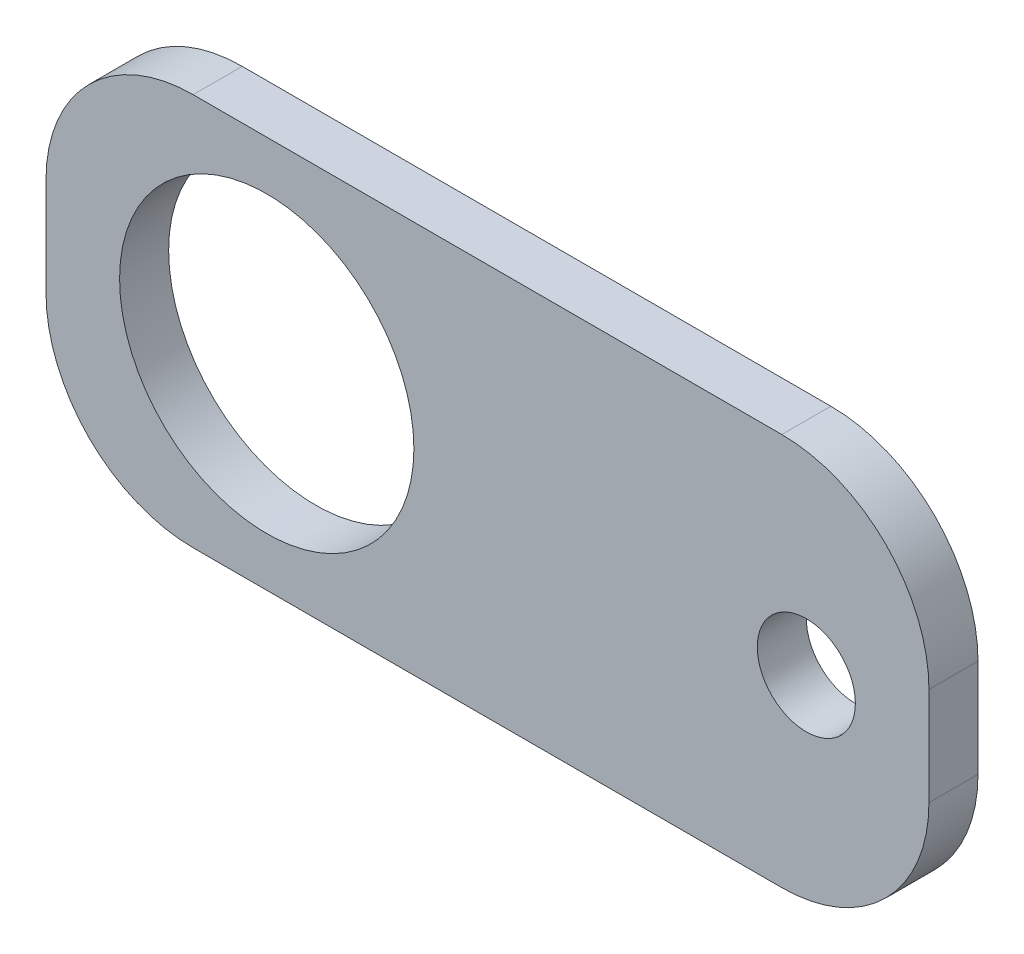
ISO-10303-21;
HEADER;
FILE_DESCRIPTION(('STEP AP214'),'2;1');
FILE_NAME('part.step','',(''),(''),'','','');
FILE_SCHEMA(('AUTOMOTIVE_DESIGN { 1 0 10303 214 1 1 1 1 }'));
ENDSEC;
DATA;
#1=APPLICATION_CONTEXT('core data for automotive mechanical design processes');
#2=APPLICATION_PROTOCOL_DEFINITION('international standard','automotive_design',2000,#1);
#3=PRODUCT_CONTEXT('',#1,'mechanical');
#4=PRODUCT('Part','Part','',(#3));
#5=PRODUCT_RELATED_PRODUCT_CATEGORY('part','',(#4));
#6=PRODUCT_DEFINITION_FORMATION('','',#4);
#7=PRODUCT_DEFINITION_CONTEXT('part definition',#1,'design');
#8=PRODUCT_DEFINITION('design','',#6,#7);
#9=PRODUCT_DEFINITION_SHAPE('','',#8);
#10=(LENGTH_UNIT() NAMED_UNIT(*) SI_UNIT(.MILLI.,.METRE.));
#11=(NAMED_UNIT(*) PLANE_ANGLE_UNIT() SI_UNIT($,.RADIAN.));
#12=(NAMED_UNIT(*) SI_UNIT($,.STERADIAN.) SOLID_ANGLE_UNIT());
#13=UNCERTAINTY_MEASURE_WITH_UNIT(LENGTH_MEASURE(1.E-05),#10,'distance_accuracy_value','');
#14=(GEOMETRIC_REPRESENTATION_CONTEXT(3) GLOBAL_UNCERTAINTY_ASSIGNED_CONTEXT((#13)) GLOBAL_UNIT_ASSIGNED_CONTEXT((#10,
#11,#12)) REPRESENTATION_CONTEXT('',''));
#15=CARTESIAN_POINT('',(0.,0.,0.));
#16=DIRECTION('',(0.,0.,1.));
#17=DIRECTION('',(1.,0.,0.));
#18=AXIS2_PLACEMENT_3D('',#15,#16,#17);
#19=CARTESIAN_POINT('',(0.,0.,1.));
#20=DIRECTION('',(0.,0.,1.));
#21=DIRECTION('',(1.,0.,0.));
#22=AXIS2_PLACEMENT_3D('',#19,#20,#21);
#23=PLANE('',#22);
#24=CARTESIAN_POINT('',(15.5,4.,1.));
#25=DIRECTION('',(0.,0.,1.));
#26=DIRECTION('',(1.,0.,0.));
#27=AXIS2_PLACEMENT_3D('',#24,#25,#26);
#28=CIRCLE('',#27,1.);
#29=CARTESIAN_POINT('',(16.5,4.,1.));
#30=VERTEX_POINT('',#29);
#31=EDGE_CURVE('E150',#30,#30,#28,.T.);
#32=ORIENTED_EDGE('',*,*,#31,.F.);
#33=EDGE_LOOP('',(#32));
#34=FACE_BOUND('',#33,.T.);
#35=DIRECTION('',(1.,0.,0.));
#36=VECTOR('',#35,1.);
#37=CARTESIAN_POINT('',(0.,0.,1.));
#38=LINE('',#37,#36);
#39=CARTESIAN_POINT('',(3.,0.,1.));
#40=VERTEX_POINT('',#39);
#41=CARTESIAN_POINT('',(15.,0.,1.));
#42=VERTEX_POINT('',#41);
#43=EDGE_CURVE('E156',#40,#42,#38,.T.);
#44=ORIENTED_EDGE('',*,*,#43,.T.);
#45=CARTESIAN_POINT('',(15.,3.,1.));
#46=DIRECTION('',(0.,0.,1.));
#47=DIRECTION('',(1.,0.,0.));
#48=AXIS2_PLACEMENT_3D('',#45,#46,#47);
#49=CIRCLE('',#48,3.);
#50=CARTESIAN_POINT('',(18.,3.,1.));
#51=VERTEX_POINT('',#50);
#52=EDGE_CURVE('E180',#42,#51,#49,.T.);
#53=ORIENTED_EDGE('',*,*,#52,.T.);
#54=DIRECTION('',(0.,1.,0.));
#55=VECTOR('',#54,1.);
#56=CARTESIAN_POINT('',(18.,0.,1.));
#57=LINE('',#56,#55);
#58=CARTESIAN_POINT('',(18.,5.,1.));
#59=VERTEX_POINT('',#58);
#60=EDGE_CURVE('E133',#51,#59,#57,.T.);
#61=ORIENTED_EDGE('',*,*,#60,.T.);
#62=CARTESIAN_POINT('',(15.,5.,1.));
#63=DIRECTION('',(0.,0.,1.));
#64=DIRECTION('',(1.,0.,0.));
#65=AXIS2_PLACEMENT_3D('',#62,#63,#64);
#66=CIRCLE('',#65,3.);
#67=CARTESIAN_POINT('',(15.,8.,1.));
#68=VERTEX_POINT('',#67);
#69=EDGE_CURVE('E172',#59,#68,#66,.T.);
#70=ORIENTED_EDGE('',*,*,#69,.T.);
#71=DIRECTION('',(-1.,0.,0.));
#72=VECTOR('',#71,1.);
#73=CARTESIAN_POINT('',(0.,8.,1.));
#74=LINE('',#73,#72);
#75=CARTESIAN_POINT('',(3.,8.,1.));
#76=VERTEX_POINT('',#75);
#77=EDGE_CURVE('E195',#68,#76,#74,.T.);
#78=ORIENTED_EDGE('',*,*,#77,.T.);
#79=CARTESIAN_POINT('',(3.,5.,1.));
#80=DIRECTION('',(0.,0.,1.));
#81=DIRECTION('',(1.,0.,0.));
#82=AXIS2_PLACEMENT_3D('',#79,#80,#81);
#83=CIRCLE('',#82,3.);
#84=CARTESIAN_POINT('',(0.,5.,1.));
#85=VERTEX_POINT('',#84);
#86=EDGE_CURVE('E68',#76,#85,#83,.T.);
#87=ORIENTED_EDGE('',*,*,#86,.T.);
#88=DIRECTION('',(0.,-1.,0.));
#89=VECTOR('',#88,1.);
#90=CARTESIAN_POINT('',(0.,0.,1.));
#91=LINE('',#90,#89);
#92=CARTESIAN_POINT('',(0.,3.,1.));
#93=VERTEX_POINT('',#92);
#94=EDGE_CURVE('E158',#85,#93,#91,.T.);
#95=ORIENTED_EDGE('',*,*,#94,.T.);
#96=CARTESIAN_POINT('',(3.,3.,1.));
#97=DIRECTION('',(0.,0.,1.));
#98=DIRECTION('',(1.,0.,0.));
#99=AXIS2_PLACEMENT_3D('',#96,#97,#98);
#100=CIRCLE('',#99,3.);
#101=EDGE_CURVE('E177',#93,#40,#100,.T.);
#102=ORIENTED_EDGE('',*,*,#101,.T.);
#103=EDGE_LOOP('',(#44,#53,#61,#70,#78,#87,#95,#102));
#104=FACE_BOUND('',#103,.T.);
#105=CARTESIAN_POINT('',(4.5,4.,1.));
#106=DIRECTION('',(0.,0.,1.));
#107=DIRECTION('',(1.,0.,0.));
#108=AXIS2_PLACEMENT_3D('',#105,#106,#107);
#109=CIRCLE('',#108,3.);
#110=CARTESIAN_POINT('',(7.5,4.,1.));
#111=VERTEX_POINT('',#110);
#112=EDGE_CURVE('E217',#111,#111,#109,.T.);
#113=ORIENTED_EDGE('',*,*,#112,.F.);
#114=EDGE_LOOP('',(#113));
#115=FACE_BOUND('',#114,.T.);
#116=ADVANCED_FACE('F45',(#34,#104,#115),#23,.T.);
#117=CARTESIAN_POINT('',(0.,0.,0.));
#118=DIRECTION('',(0.,0.,1.));
#119=DIRECTION('',(1.,0.,0.));
#120=AXIS2_PLACEMENT_3D('',#117,#118,#119);
#121=PLANE('',#120);
#122=DIRECTION('',(0.,1.,0.));
#123=VECTOR('',#122,1.);
#124=CARTESIAN_POINT('',(18.,0.,0.));
#125=LINE('',#124,#123);
#126=CARTESIAN_POINT('',(18.,3.,0.));
#127=VERTEX_POINT('',#126);
#128=CARTESIAN_POINT('',(18.,5.,0.));
#129=VERTEX_POINT('',#128);
#130=EDGE_CURVE('E130',#127,#129,#125,.T.);
#131=ORIENTED_EDGE('',*,*,#130,.F.);
#132=CARTESIAN_POINT('',(15.,3.,0.));
#133=DIRECTION('',(0.,0.,1.));
#134=DIRECTION('',(1.,0.,0.));
#135=AXIS2_PLACEMENT_3D('',#132,#133,#134);
#136=CIRCLE('',#135,3.);
#137=CARTESIAN_POINT('',(15.,0.,0.));
#138=VERTEX_POINT('',#137);
#139=EDGE_CURVE('E112',#127,#138,#136,.F.);
#140=ORIENTED_EDGE('',*,*,#139,.T.);
#141=DIRECTION('',(1.,0.,0.));
#142=VECTOR('',#141,1.);
#143=CARTESIAN_POINT('',(0.,0.,0.));
#144=LINE('',#143,#142);
#145=CARTESIAN_POINT('',(3.,0.,0.));
#146=VERTEX_POINT('',#145);
#147=EDGE_CURVE('E143',#146,#138,#144,.T.);
#148=ORIENTED_EDGE('',*,*,#147,.F.);
#149=CARTESIAN_POINT('',(3.,3.,0.));
#150=DIRECTION('',(0.,0.,1.));
#151=DIRECTION('',(1.,0.,0.));
#152=AXIS2_PLACEMENT_3D('',#149,#150,#151);
#153=CIRCLE('',#152,3.);
#154=CARTESIAN_POINT('',(0.,3.,0.));
#155=VERTEX_POINT('',#154);
#156=EDGE_CURVE('E124',#146,#155,#153,.F.);
#157=ORIENTED_EDGE('',*,*,#156,.T.);
#158=DIRECTION('',(0.,-1.,0.));
#159=VECTOR('',#158,1.);
#160=CARTESIAN_POINT('',(0.,0.,0.));
#161=LINE('',#160,#159);
#162=CARTESIAN_POINT('',(0.,5.,0.));
#163=VERTEX_POINT('',#162);
#164=EDGE_CURVE('E148',#163,#155,#161,.T.);
#165=ORIENTED_EDGE('',*,*,#164,.F.);
#166=CARTESIAN_POINT('',(3.,5.,0.));
#167=DIRECTION('',(0.,0.,1.));
#168=DIRECTION('',(1.,0.,0.));
#169=AXIS2_PLACEMENT_3D('',#166,#167,#168);
#170=CIRCLE('',#169,3.);
#171=CARTESIAN_POINT('',(3.,8.,0.));
#172=VERTEX_POINT('',#171);
#173=EDGE_CURVE('E162',#163,#172,#170,.F.);
#174=ORIENTED_EDGE('',*,*,#173,.T.);
#175=DIRECTION('',(-1.,0.,0.));
#176=VECTOR('',#175,1.);
#177=CARTESIAN_POINT('',(0.,8.,0.));
#178=LINE('',#177,#176);
#179=CARTESIAN_POINT('',(15.,8.,0.));
#180=VERTEX_POINT('',#179);
#181=EDGE_CURVE('E142',#180,#172,#178,.T.);
#182=ORIENTED_EDGE('',*,*,#181,.F.);
#183=CARTESIAN_POINT('',(15.,5.,0.));
#184=DIRECTION('',(0.,0.,1.));
#185=DIRECTION('',(1.,0.,0.));
#186=AXIS2_PLACEMENT_3D('',#183,#184,#185);
#187=CIRCLE('',#186,3.);
#188=EDGE_CURVE('E135',#180,#129,#187,.F.);
#189=ORIENTED_EDGE('',*,*,#188,.T.);
#190=EDGE_LOOP('',(#131,#140,#148,#157,#165,#174,#182,#189));
#191=FACE_BOUND('',#190,.T.);
#192=CARTESIAN_POINT('',(15.5,4.,0.));
#193=DIRECTION('',(0.,0.,1.));
#194=DIRECTION('',(1.,0.,0.));
#195=AXIS2_PLACEMENT_3D('',#192,#193,#194);
#196=CIRCLE('',#195,1.);
#197=CARTESIAN_POINT('',(16.5,4.,0.));
#198=VERTEX_POINT('',#197);
#199=EDGE_CURVE('E213',#198,#198,#196,.T.);
#200=ORIENTED_EDGE('',*,*,#199,.T.);
#201=EDGE_LOOP('',(#200));
#202=FACE_BOUND('',#201,.T.);
#203=CARTESIAN_POINT('',(4.5,4.,0.));
#204=DIRECTION('',(0.,0.,1.));
#205=DIRECTION('',(1.,0.,0.));
#206=AXIS2_PLACEMENT_3D('',#203,#204,#205);
#207=CIRCLE('',#206,3.);
#208=CARTESIAN_POINT('',(7.5,4.,0.));
#209=VERTEX_POINT('',#208);
#210=EDGE_CURVE('E221',#209,#209,#207,.T.);
#211=ORIENTED_EDGE('',*,*,#210,.T.);
#212=EDGE_LOOP('',(#211));
#213=FACE_BOUND('',#212,.T.);
#214=ADVANCED_FACE('F138',(#191,#202,#213),#121,.F.);
#215=CARTESIAN_POINT('',(0.,0.,1.));
#216=DIRECTION('',(0.,1.,0.));
#217=DIRECTION('',(-1.,0.,0.));
#218=AXIS2_PLACEMENT_3D('',#215,#216,#217);
#219=PLANE('',#218);
#220=ORIENTED_EDGE('',*,*,#147,.T.);
#221=DIRECTION('',(0.,0.,-1.));
#222=VECTOR('',#221,1.);
#223=CARTESIAN_POINT('',(15.,0.,1.));
#224=LINE('',#223,#222);
#225=EDGE_CURVE('E117',#138,#42,#224,.F.);
#226=ORIENTED_EDGE('',*,*,#225,.T.);
#227=ORIENTED_EDGE('',*,*,#43,.F.);
#228=DIRECTION('',(0.,0.,-1.));
#229=VECTOR('',#228,1.);
#230=CARTESIAN_POINT('',(3.,0.,1.));
#231=LINE('',#230,#229);
#232=EDGE_CURVE('E123',#40,#146,#231,.T.);
#233=ORIENTED_EDGE('',*,*,#232,.T.);
#234=EDGE_LOOP('',(#220,#226,#227,#233));
#235=FACE_BOUND('',#234,.T.);
#236=ADVANCED_FACE('F239',(#235),#219,.F.);
#237=CARTESIAN_POINT('',(18.,0.,1.));
#238=DIRECTION('',(-1.,0.,0.));
#239=DIRECTION('',(0.,0.,1.));
#240=AXIS2_PLACEMENT_3D('',#237,#238,#239);
#241=PLANE('',#240);
#242=ORIENTED_EDGE('',*,*,#60,.F.);
#243=DIRECTION('',(0.,0.,-1.));
#244=VECTOR('',#243,1.);
#245=CARTESIAN_POINT('',(18.,3.,1.));
#246=LINE('',#245,#244);
#247=EDGE_CURVE('E116',#51,#127,#246,.T.);
#248=ORIENTED_EDGE('',*,*,#247,.T.);
#249=ORIENTED_EDGE('',*,*,#130,.T.);
#250=DIRECTION('',(0.,0.,-1.));
#251=VECTOR('',#250,1.);
#252=CARTESIAN_POINT('',(18.,5.,1.));
#253=LINE('',#252,#251);
#254=EDGE_CURVE('E136',#129,#59,#253,.F.);
#255=ORIENTED_EDGE('',*,*,#254,.T.);
#256=EDGE_LOOP('',(#242,#248,#249,#255));
#257=FACE_BOUND('',#256,.T.);
#258=ADVANCED_FACE('F129',(#257),#241,.F.);
#259=CARTESIAN_POINT('',(0.,8.,1.));
#260=DIRECTION('',(0.,-1.,0.));
#261=DIRECTION('',(0.,0.,-1.));
#262=AXIS2_PLACEMENT_3D('',#259,#260,#261);
#263=PLANE('',#262);
#264=ORIENTED_EDGE('',*,*,#181,.T.);
#265=DIRECTION('',(0.,0.,-1.));
#266=VECTOR('',#265,1.);
#267=CARTESIAN_POINT('',(3.,8.,1.));
#268=LINE('',#267,#266);
#269=EDGE_CURVE('E11',#172,#76,#268,.F.);
#270=ORIENTED_EDGE('',*,*,#269,.T.);
#271=ORIENTED_EDGE('',*,*,#77,.F.);
#272=DIRECTION('',(0.,0.,-1.));
#273=VECTOR('',#272,1.);
#274=CARTESIAN_POINT('',(15.,8.,1.));
#275=LINE('',#274,#273);
#276=EDGE_CURVE('E54',#68,#180,#275,.T.);
#277=ORIENTED_EDGE('',*,*,#276,.T.);
#278=EDGE_LOOP('',(#264,#270,#271,#277));
#279=FACE_BOUND('',#278,.T.);
#280=ADVANCED_FACE('F193',(#279),#263,.F.);
#281=CARTESIAN_POINT('',(0.,0.,1.));
#282=DIRECTION('',(1.,0.,0.));
#283=DIRECTION('',(0.,0.,-1.));
#284=AXIS2_PLACEMENT_3D('',#281,#282,#283);
#285=PLANE('',#284);
#286=ORIENTED_EDGE('',*,*,#164,.T.);
#287=DIRECTION('',(0.,0.,-1.));
#288=VECTOR('',#287,1.);
#289=CARTESIAN_POINT('',(0.,3.,1.));
#290=LINE('',#289,#288);
#291=EDGE_CURVE('E61',#155,#93,#290,.F.);
#292=ORIENTED_EDGE('',*,*,#291,.T.);
#293=ORIENTED_EDGE('',*,*,#94,.F.);
#294=DIRECTION('',(0.,0.,-1.));
#295=VECTOR('',#294,1.);
#296=CARTESIAN_POINT('',(0.,5.,1.));
#297=LINE('',#296,#295);
#298=EDGE_CURVE('E183',#85,#163,#297,.T.);
#299=ORIENTED_EDGE('',*,*,#298,.T.);
#300=EDGE_LOOP('',(#286,#292,#293,#299));
#301=FACE_BOUND('',#300,.T.);
#302=ADVANCED_FACE('F202',(#301),#285,.F.);
#303=CARTESIAN_POINT('',(15.5,4.,1.));
#304=DIRECTION('',(0.,0.,-1.));
#305=DIRECTION('',(-1.,0.,0.));
#306=AXIS2_PLACEMENT_3D('',#303,#304,#305);
#307=CYLINDRICAL_SURFACE('',#306,1.);
#308=ORIENTED_EDGE('',*,*,#31,.T.);
#309=EDGE_LOOP('',(#308));
#310=FACE_BOUND('',#309,.T.);
#311=ORIENTED_EDGE('',*,*,#199,.F.);
#312=EDGE_LOOP('',(#311));
#313=FACE_BOUND('',#312,.T.);
#314=ADVANCED_FACE('F243',(#310,#313),#307,.F.);
#315=CARTESIAN_POINT('',(4.5,4.,1.));
#316=DIRECTION('',(0.,0.,-1.));
#317=DIRECTION('',(-1.,0.,0.));
#318=AXIS2_PLACEMENT_3D('',#315,#316,#317);
#319=CYLINDRICAL_SURFACE('',#318,3.);
#320=ORIENTED_EDGE('',*,*,#112,.T.);
#321=EDGE_LOOP('',(#320));
#322=FACE_BOUND('',#321,.T.);
#323=ORIENTED_EDGE('',*,*,#210,.F.);
#324=EDGE_LOOP('',(#323));
#325=FACE_BOUND('',#324,.T.);
#326=ADVANCED_FACE('F229',(#322,#325),#319,.F.);
#327=CARTESIAN_POINT('',(15.,3.,1.));
#328=DIRECTION('',(0.,0.,-1.));
#329=DIRECTION('',(-1.,0.,0.));
#330=AXIS2_PLACEMENT_3D('',#327,#328,#329);
#331=CYLINDRICAL_SURFACE('',#330,3.);
#332=ORIENTED_EDGE('',*,*,#52,.F.);
#333=ORIENTED_EDGE('',*,*,#225,.F.);
#334=ORIENTED_EDGE('',*,*,#139,.F.);
#335=ORIENTED_EDGE('',*,*,#247,.F.);
#336=EDGE_LOOP('',(#332,#333,#334,#335));
#337=FACE_BOUND('',#336,.T.);
#338=ADVANCED_FACE('F115',(#337),#331,.T.);
#339=CARTESIAN_POINT('',(3.,3.,1.));
#340=DIRECTION('',(0.,0.,-1.));
#341=DIRECTION('',(-1.,0.,0.));
#342=AXIS2_PLACEMENT_3D('',#339,#340,#341);
#343=CYLINDRICAL_SURFACE('',#342,3.);
#344=ORIENTED_EDGE('',*,*,#101,.F.);
#345=ORIENTED_EDGE('',*,*,#291,.F.);
#346=ORIENTED_EDGE('',*,*,#156,.F.);
#347=ORIENTED_EDGE('',*,*,#232,.F.);
#348=EDGE_LOOP('',(#344,#345,#346,#347));
#349=FACE_BOUND('',#348,.T.);
#350=ADVANCED_FACE('F257',(#349),#343,.T.);
#351=CARTESIAN_POINT('',(3.,5.,1.));
#352=DIRECTION('',(0.,0.,-1.));
#353=DIRECTION('',(-1.,0.,0.));
#354=AXIS2_PLACEMENT_3D('',#351,#352,#353);
#355=CYLINDRICAL_SURFACE('',#354,3.);
#356=ORIENTED_EDGE('',*,*,#86,.F.);
#357=ORIENTED_EDGE('',*,*,#269,.F.);
#358=ORIENTED_EDGE('',*,*,#173,.F.);
#359=ORIENTED_EDGE('',*,*,#298,.F.);
#360=EDGE_LOOP('',(#356,#357,#358,#359));
#361=FACE_BOUND('',#360,.T.);
#362=ADVANCED_FACE('F201',(#361),#355,.T.);
#363=CARTESIAN_POINT('',(15.,5.,1.));
#364=DIRECTION('',(0.,0.,-1.));
#365=DIRECTION('',(-1.,0.,0.));
#366=AXIS2_PLACEMENT_3D('',#363,#364,#365);
#367=CYLINDRICAL_SURFACE('',#366,3.);
#368=ORIENTED_EDGE('',*,*,#69,.F.);
#369=ORIENTED_EDGE('',*,*,#254,.F.);
#370=ORIENTED_EDGE('',*,*,#188,.F.);
#371=ORIENTED_EDGE('',*,*,#276,.F.);
#372=EDGE_LOOP('',(#368,#369,#370,#371));
#373=FACE_BOUND('',#372,.T.);
#374=ADVANCED_FACE('F47',(#373),#367,.T.);
#375=CLOSED_SHELL('',(#116,#214,#236,#258,#280,#302,#314,#326,#338,#350,#362,#374));
#376=MANIFOLD_SOLID_BREP('B2',#375);
#377=ADVANCED_BREP_SHAPE_REPRESENTATION('',(#18,#376),#14);
#378=SHAPE_DEFINITION_REPRESENTATION(#9,#377);
ENDSEC;
END-ISO-10303-21;
